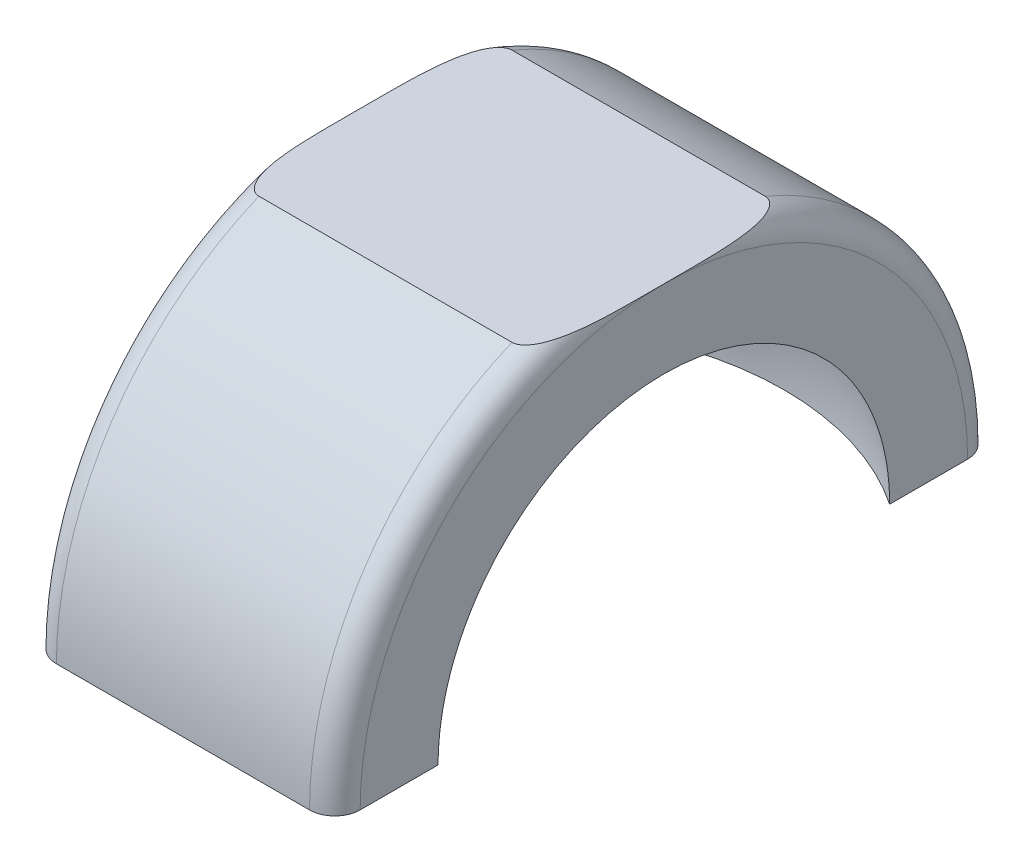
ISO-10303-21;
HEADER;
FILE_DESCRIPTION(('STEP AP214'),'2;1');
FILE_NAME('part.step','',(''),(''),'','','');
FILE_SCHEMA(('AUTOMOTIVE_DESIGN { 1 0 10303 214 1 1 1 1 }'));
ENDSEC;
DATA;
#1=APPLICATION_CONTEXT('core data for automotive mechanical design processes');
#2=APPLICATION_PROTOCOL_DEFINITION('international standard','automotive_design',2000,#1);
#3=PRODUCT_CONTEXT('',#1,'mechanical');
#4=PRODUCT('Part','Part','',(#3));
#5=PRODUCT_RELATED_PRODUCT_CATEGORY('part','',(#4));
#6=PRODUCT_DEFINITION_FORMATION('','',#4);
#7=PRODUCT_DEFINITION_CONTEXT('part definition',#1,'design');
#8=PRODUCT_DEFINITION('design','',#6,#7);
#9=PRODUCT_DEFINITION_SHAPE('','',#8);
#10=(LENGTH_UNIT() NAMED_UNIT(*) SI_UNIT(.MILLI.,.METRE.));
#11=(NAMED_UNIT(*) PLANE_ANGLE_UNIT() SI_UNIT($,.RADIAN.));
#12=(NAMED_UNIT(*) SI_UNIT($,.STERADIAN.) SOLID_ANGLE_UNIT());
#13=UNCERTAINTY_MEASURE_WITH_UNIT(LENGTH_MEASURE(1.E-05),#10,'distance_accuracy_value','');
#14=(GEOMETRIC_REPRESENTATION_CONTEXT(3) GLOBAL_UNCERTAINTY_ASSIGNED_CONTEXT((#13)) GLOBAL_UNIT_ASSIGNED_CONTEXT((#10,
#11,#12)) REPRESENTATION_CONTEXT('',''));
#15=CARTESIAN_POINT('',(0.,0.,0.));
#16=DIRECTION('',(0.,0.,1.));
#17=DIRECTION('',(1.,0.,0.));
#18=AXIS2_PLACEMENT_3D('',#15,#16,#17);
#19=CARTESIAN_POINT('',(10.,0.,0.));
#20=DIRECTION('',(-1.,0.,0.));
#21=DIRECTION('',(0.,0.,1.));
#22=AXIS2_PLACEMENT_3D('',#19,#20,#21);
#23=TOROIDAL_SURFACE('',#22,24.,2.);
#24=CARTESIAN_POINT('',(12.,0.,0.));
#25=DIRECTION('',(-1.,0.,0.));
#26=DIRECTION('',(0.,0.,1.));
#27=AXIS2_PLACEMENT_3D('',#24,#25,#26);
#28=CIRCLE('',#27,24.);
#29=CARTESIAN_POINT('',(12.,0.,24.));
#30=VERTEX_POINT('',#29);
#31=CARTESIAN_POINT('',(12.,24.,0.));
#32=VERTEX_POINT('',#31);
#33=EDGE_CURVE('E48',#30,#32,#28,.T.);
#34=ORIENTED_EDGE('',*,*,#33,.T.);
#35=CARTESIAN_POINT('',(12.0000000000002,24.,0.));
#36=CARTESIAN_POINT('',(12.0000032112972,24.,0.333318370624944));
#37=CARTESIAN_POINT('',(12.0000369376425,24.,0.666636690385218));
#38=CARTESIAN_POINT('',(11.9997462691406,24.,1.33327477904077));
#39=CARTESIAN_POINT('',(11.9994218731332,24.,1.66659454793725));
#40=CARTESIAN_POINT('',(11.9971167553539,24.,2.33330585522278));
#41=CARTESIAN_POINT('',(11.995135657108,24.,2.66669739270359));
#42=CARTESIAN_POINT('',(11.987382631693,24.,3.33342237898503));
#43=CARTESIAN_POINT('',(11.9816110138256,24.,3.66675583030574));
#44=CARTESIAN_POINT('',(11.9660821554231,24.,4.22925457777455));
#45=CARTESIAN_POINT('',(11.9581306579488,24.,4.45846690104528));
#46=CARTESIAN_POINT('',(11.9376839843161,24.,4.91668810412272));
#47=CARTESIAN_POINT('',(11.9251890218679,24.,5.14569699299054));
#48=CARTESIAN_POINT('',(11.8940563210572,24.,5.60339568674352));
#49=CARTESIAN_POINT('',(11.8754163137367,24.,5.83208534238817));
#50=CARTESIAN_POINT('',(11.8299717017088,24.,6.28863487959647));
#51=CARTESIAN_POINT('',(11.8031689811131,24.,6.5164949403774));
#52=CARTESIAN_POINT('',(11.7472776739321,24.,6.91014618979482));
#53=CARTESIAN_POINT('',(11.7207036250663,24.,7.07628927305245));
#54=CARTESIAN_POINT('',(11.6602651251751,24.,7.40722844639932));
#55=CARTESIAN_POINT('',(11.6264021712281,24.,7.57202480589031));
#56=CARTESIAN_POINT('',(11.5494119212752,24.,7.89981844597661));
#57=CARTESIAN_POINT('',(11.5062684373758,24.,8.06281205295968));
#58=CARTESIAN_POINT('',(11.4325985380382,24.,8.3045026196003));
#59=CARTESIAN_POINT('',(11.4065607418726,24.,8.38457040780352));
#60=CARTESIAN_POINT('',(11.3510253330141,24.,8.54349044057223));
#61=CARTESIAN_POINT('',(11.321528415153,24.,8.62234292566682));
#62=CARTESIAN_POINT('',(11.2581656766794,24.,8.77926831696839));
#63=CARTESIAN_POINT('',(11.2242565034422,24.,8.85732386543028));
#64=CARTESIAN_POINT('',(11.1515835022793,24.,9.01112038904928));
#65=CARTESIAN_POINT('',(11.1128221897752,24.,9.08686253837903));
#66=CARTESIAN_POINT('',(11.0297277782235,24.,9.23464189441576));
#67=CARTESIAN_POINT('',(10.9854309122107,24.,9.3066992506055));
#68=CARTESIAN_POINT('',(10.8899193526613,24.,9.44601447281588));
#69=CARTESIAN_POINT('',(10.8387168937979,24.,9.51328051264976));
#70=CARTESIAN_POINT('',(10.7452380030842,24.,9.62063081920906));
#71=CARTESIAN_POINT('',(10.7051812793181,24.,9.66263473592002));
#72=CARTESIAN_POINT('',(10.6205313029516,24.,9.74197770663356));
#73=CARTESIAN_POINT('',(10.5759332419576,24.,9.77931172096246));
#74=CARTESIAN_POINT('',(10.4813819449202,24.,9.84781787827383));
#75=CARTESIAN_POINT('',(10.4313750129516,24.,9.87891742712105));
#76=CARTESIAN_POINT('',(10.3266729907569,24.,9.93185418938677));
#77=CARTESIAN_POINT('',(10.2719900844932,24.,9.95371464266827));
#78=CARTESIAN_POINT('',(10.1730273511311,24.,9.98169520964225));
#79=CARTESIAN_POINT('',(10.129468790481,24.,9.99035573108248));
#80=CARTESIAN_POINT('',(10.0415136477378,24.,10.0001366298849));
#81=CARTESIAN_POINT('',(9.99711761101358,24.,10.0012617551721));
#82=CARTESIAN_POINT('',(9.90882676394153,24.,9.99586257111336));
#83=CARTESIAN_POINT('',(9.86493171650638,24.,9.98934204559354));
#84=CARTESIAN_POINT('',(9.77878109124616,24.,9.96928364420115));
#85=CARTESIAN_POINT('',(9.7365269146013,24.,9.95573990676722));
#86=CARTESIAN_POINT('',(9.63992720292629,24.,9.91684528754731));
#87=CARTESIAN_POINT('',(9.58658719557515,24.,9.88901308058598));
#88=CARTESIAN_POINT('',(9.48501505356487,24.,9.82524143179271));
#89=CARTESIAN_POINT('',(9.43679494660291,24.,9.78928349439656));
#90=CARTESIAN_POINT('',(9.31596862747712,24.,9.6866929371816));
#91=CARTESIAN_POINT('',(9.24755308269309,24.,9.61517616781321));
#92=CARTESIAN_POINT('',(9.12173798187126,24.,9.46311544551836));
#93=CARTESIAN_POINT('',(9.06436974993364,24.,9.38254682034423));
#94=CARTESIAN_POINT('',(8.95651782036297,24.,9.21279170083568));
#95=CARTESIAN_POINT('',(8.90636765207394,24.,9.12339658073665));
#96=CARTESIAN_POINT('',(8.81362150969052,24.,8.9407222863304));
#97=CARTESIAN_POINT('',(8.77103405557575,24.,8.84743887576215));
#98=CARTESIAN_POINT('',(8.69200154728926,24.,8.65821094587404));
#99=CARTESIAN_POINT('',(8.65556358713586,24.,8.56226349986666));
#100=CARTESIAN_POINT('',(8.58785036928036,24.,8.36865771043921));
#101=CARTESIAN_POINT('',(8.55657165945949,24.,8.27100055979621));
#102=CARTESIAN_POINT('',(8.49452950865645,24.,8.06158756638733));
#103=CARTESIAN_POINT('',(8.46436615854089,24.,7.94965518527957));
#104=CARTESIAN_POINT('',(8.40865247510728,24.,7.7246404670472));
#105=CARTESIAN_POINT('',(8.38310307614887,24.,7.6115579018884));
#106=CARTESIAN_POINT('',(8.31224888257978,24.,7.2709188779993));
#107=CARTESIAN_POINT('',(8.27278734062413,24.,7.04214664364708));
#108=CARTESIAN_POINT('',(8.20517744522899,24.,6.58219576041598));
#109=CARTESIAN_POINT('',(8.17706983811534,24.,6.35101144599837));
#110=CARTESIAN_POINT('',(8.12947856099722,24.,5.8877340102058));
#111=CARTESIAN_POINT('',(8.10999655460494,24.,5.65564072221853));
#112=CARTESIAN_POINT('',(8.07725644923241,24.,5.18768771328294));
#113=CARTESIAN_POINT('',(8.06409170355674,24.,4.95182174939653));
#114=CARTESIAN_POINT('',(8.04263936971829,24.,4.47985352954237));
#115=CARTESIAN_POINT('',(8.03435229573301,24.,4.24375125129052));
#116=CARTESIAN_POINT('',(8.02126725748994,24.,3.77221548470928));
#117=CARTESIAN_POINT('',(8.01645816840742,24.,3.53678228489565));
#118=CARTESIAN_POINT('',(8.00916079848506,24.,3.0658976655751));
#119=CARTESIAN_POINT('',(8.00667237456718,24.,2.83044624808663));
#120=CARTESIAN_POINT('',(8.00314726486056,24.,2.36271223492861));
#121=CARTESIAN_POINT('',(8.00209143795818,24.,2.13042976235398));
#122=CARTESIAN_POINT('',(8.00071789688515,24.,1.66586244272779));
#123=CARTESIAN_POINT('',(8.00040018509202,24.,1.43357759567101));
#124=CARTESIAN_POINT('',(8.00005119091622,24.,0.968972711085982));
#125=CARTESIAN_POINT('',(8.00001995184136,24.,0.736652673546385));
#126=CARTESIAN_POINT('',(7.99999408475305,24.,0.272013202606699));
#127=CARTESIAN_POINT('',(7.99999945664451,24.,0.0396937692066078));
#128=CARTESIAN_POINT('',(8.00000084678883,24.,-0.426510676514846));
#129=CARTESIAN_POINT('',(7.9999968017643,24.,-0.660395688814065));
#130=CARTESIAN_POINT('',(8.00014190259765,24.,-1.12816670466346));
#131=CARTESIAN_POINT('',(8.00029104909999,24.,-1.36205270821367));
#132=CARTESIAN_POINT('',(8.00111370574869,24.,-1.82969701927461));
#133=CARTESIAN_POINT('',(8.00178693088462,24.,-2.06345532710612));
#134=CARTESIAN_POINT('',(8.0042336004762,24.,-2.53096518392172));
#135=CARTESIAN_POINT('',(8.00600703510534,24.,-2.76471673294754));
#136=CARTESIAN_POINT('',(8.01137795427343,24.,-3.22707915213118));
#137=CARTESIAN_POINT('',(8.01493462465703,24.,-3.45569044824237));
#138=CARTESIAN_POINT('',(8.02478304215701,24.,-3.91285583709429));
#139=CARTESIAN_POINT('',(8.03107475920861,24.,-4.14140993043618));
#140=CARTESIAN_POINT('',(8.04756811288698,24.,-4.59893086306326));
#141=CARTESIAN_POINT('',(8.05777905958928,24.,-4.82789738305847));
#142=CARTESIAN_POINT('',(8.08354488483207,24.,-5.28551435799917));
#143=CARTESIAN_POINT('',(8.09909907992984,24.,-5.51416484961358));
#144=CARTESIAN_POINT('',(8.13712372410515,24.,-5.96806426630645));
#145=CARTESIAN_POINT('',(8.15950647070729,24.,-6.19332035270045));
#146=CARTESIAN_POINT('',(8.21348655696245,24.,-6.64272797005468));
#147=CARTESIAN_POINT('',(8.2450817096124,24.,-6.86687975034626));
#148=CARTESIAN_POINT('',(8.30163784859851,24.,-7.20113297539648));
#149=CARTESIAN_POINT('',(8.32197124184282,24.,-7.31201894796625));
#150=CARTESIAN_POINT('',(8.36620724524363,24.,-7.53307208686932));
#151=CARTESIAN_POINT('',(8.39010944562003,24.,-7.64323933421482));
#152=CARTESIAN_POINT('',(8.44206801029076,24.,-7.86247240563955));
#153=CARTESIAN_POINT('',(8.47011992287844,24.,-7.97153927786498));
#154=CARTESIAN_POINT('',(8.5311633401834,24.,-8.18827023811862));
#155=CARTESIAN_POINT('',(8.56415327897659,24.,-8.29593475913078));
#156=CARTESIAN_POINT('',(8.61466662939372,24.,-8.44574106167869));
#157=CARTESIAN_POINT('',(8.6297032570958,24.,-8.48872635133043));
#158=CARTESIAN_POINT('',(8.66083866445632,24.,-8.5743183232767));
#159=CARTESIAN_POINT('',(8.67693762337307,24.,-8.6169249402904));
#160=CARTESIAN_POINT('',(8.72699164897903,24.,-8.74415829254694));
#161=CARTESIAN_POINT('',(8.76267715155773,24.,-8.82811809808563));
#162=CARTESIAN_POINT('',(8.83931969761989,24.,-8.99302837938143));
#163=CARTESIAN_POINT('',(8.88024511873908,24.,-9.07399342998768));
#164=CARTESIAN_POINT('',(8.96863876303755,24.,-9.23222566903728));
#165=CARTESIAN_POINT('',(9.01609931038123,24.,-9.30949705450595));
#166=CARTESIAN_POINT('',(9.10636111904431,24.,-9.44011000529705));
#167=CARTESIAN_POINT('',(9.14741752266106,24.,-9.49464784915385));
#168=CARTESIAN_POINT('',(9.23499202878933,24.,-9.59941876467231));
#169=CARTESIAN_POINT('',(9.28152108088911,24.,-9.64964284594727));
#170=CARTESIAN_POINT('',(9.3813411272815,24.,-9.74420685424307));
#171=CARTESIAN_POINT('',(9.43470272076706,24.,-9.78847371669067));
#172=CARTESIAN_POINT('',(9.54823001297531,24.,-9.86718895224718));
#173=CARTESIAN_POINT('',(9.60837134174992,24.,-9.9016710178199));
#174=CARTESIAN_POINT('',(9.7135502774502,24.,-9.94747630826742));
#175=CARTESIAN_POINT('',(9.75688505479648,24.,-9.9626880147675));
#176=CARTESIAN_POINT('',(9.84548101624645,24.,-9.98574109251738));
#177=CARTESIAN_POINT('',(9.89074030445104,24.,-9.99358954941912));
#178=CARTESIAN_POINT('',(9.98212867114721,24.,-10.0011557954406));
#179=CARTESIAN_POINT('',(10.0282604715755,24.,-10.0008414669901));
#180=CARTESIAN_POINT('',(10.1197394795816,24.,-9.99203622265434));
#181=CARTESIAN_POINT('',(10.1650863089253,24.,-9.98354147090436));
#182=CARTESIAN_POINT('',(10.2518309149631,24.,-9.95974527501826));
#183=CARTESIAN_POINT('',(10.2933146290992,24.,-9.94474933730522));
#184=CARTESIAN_POINT('',(10.3737684132198,24.,-9.90915072481761));
#185=CARTESIAN_POINT('',(10.4127375521171,24.,-9.88854598780835));
#186=CARTESIAN_POINT('',(10.514310353692,24.,-9.82681028590918));
#187=CARTESIAN_POINT('',(10.5743167505716,24.,-9.78141983209891));
#188=CARTESIAN_POINT('',(10.6867601738288,24.,-9.68204746446342));
#189=CARTESIAN_POINT('',(10.7391710802959,24.,-9.6280371860263));
#190=CARTESIAN_POINT('',(10.8334718249548,24.,-9.51885468523465));
#191=CARTESIAN_POINT('',(10.8758653995675,24.,-9.46410990591669));
#192=CARTESIAN_POINT('',(10.955865319261,24.,-9.35119562209922));
#193=CARTESIAN_POINT('',(10.993467288732,24.,-9.29302305728638));
#194=CARTESIAN_POINT('',(11.0646165213932,24.,-9.17413072766235));
#195=CARTESIAN_POINT('',(11.0981563479977,24.,-9.11340655728604));
#196=CARTESIAN_POINT('',(11.1616716941555,24.,-8.99016734569872));
#197=CARTESIAN_POINT('',(11.1916485345535,24.,-8.92765297886867));
#198=CARTESIAN_POINT('',(11.2622823804187,24.,-8.77070588448407));
#199=CARTESIAN_POINT('',(11.3011003935321,24.,-8.67544711598761));
#200=CARTESIAN_POINT('',(11.3732088503867,24.,-8.48284081520179));
#201=CARTESIAN_POINT('',(11.406496512795,24.,-8.38549225953626));
#202=CARTESIAN_POINT('',(11.4684843216113,24.,-8.18917313339979));
#203=CARTESIAN_POINT('',(11.4971765073101,24.,-8.09020006880909));
#204=CARTESIAN_POINT('',(11.550609774882,24.,-7.89118646355778));
#205=CARTESIAN_POINT('',(11.575350152715,24.,-7.79114573606544));
#206=CARTESIAN_POINT('',(11.6447376713912,24.,-7.48887108554338));
#207=CARTESIAN_POINT('',(11.6842576192666,24.,-7.28545818128766));
#208=CARTESIAN_POINT('',(11.7530008244918,24.,-6.87720545550559));
#209=CARTESIAN_POINT('',(11.7822352536171,24.,-6.67236743013971));
#210=CARTESIAN_POINT('',(11.8405401585336,24.,-6.19926402227572));
#211=CARTESIAN_POINT('',(11.8668540655969,24.,-5.93066406958119));
#212=CARTESIAN_POINT('',(11.9099344136815,24.,-5.39268113493136));
#213=CARTESIAN_POINT('',(11.9266983618385,24.,-5.12329796695763));
#214=CARTESIAN_POINT('',(11.9534755921896,24.,-4.58390967942385));
#215=CARTESIAN_POINT('',(11.9634812739808,24.,-4.31390420114343));
#216=CARTESIAN_POINT('',(11.9788819188098,24.,-3.77375930489971));
#217=CARTESIAN_POINT('',(11.9842766375968,24.,-3.50361988059937));
#218=CARTESIAN_POINT('',(11.9921348699951,24.,-2.96395555881359));
#219=CARTESIAN_POINT('',(11.9946054270657,24.,-2.69443075182466));
#220=CARTESIAN_POINT('',(11.9979221739512,24.,-2.15536833218577));
#221=CARTESIAN_POINT('',(11.998768333373,24.,-1.88583071939057));
#222=CARTESIAN_POINT('',(11.9997534150278,24.,-1.34691063250215));
#223=CARTESIAN_POINT('',(11.9998927458558,24.,-1.07752815880793));
#224=CARTESIAN_POINT('',(12.0000147405231,24.,-0.538763779001592));
#225=CARTESIAN_POINT('',(11.9999974046881,24.,-0.269381872889463));
#226=CARTESIAN_POINT('',(12.0000000000002,24.,0.));
#227=B_SPLINE_CURVE_WITH_KNOTS('',3,(#35,#36,#37,#38,#39,#40,#41,#42,#43,#44,#45,#46,#47,#48,
#49,#50,#51,#52,#53,#54,#55,#56,#57,#58,#59,#60,#61,#62,#63,#64,#65,#66,#67,#68,#69,#70,#71,#72,
#73,#74,#75,#76,#77,#78,#79,#80,#81,#82,#83,#84,#85,#86,#87,#88,#89,#90,#91,#92,#93,#94,#95,#96,
#97,#98,#99,#100,#101,#102,#103,#104,#105,#106,#107,#108,#109,#110,#111,#112,#113,#114,#115,
#116,#117,#118,#119,#120,#121,#122,#123,#124,#125,#126,#127,#128,#129,#130,#131,#132,#133,#134,
#135,#136,#137,#138,#139,#140,#141,#142,#143,#144,#145,#146,#147,#148,#149,#150,#151,#152,#153,
#154,#155,#156,#157,#158,#159,#160,#161,#162,#163,#164,#165,#166,#167,#168,#169,#170,#171,#172,
#173,#174,#175,#176,#177,#178,#179,#180,#181,#182,#183,#184,#185,#186,#187,#188,#189,#190,#191,
#192,#193,#194,#195,#196,#197,#198,#199,#200,#201,#202,#203,#204,#205,#206,#207,#208,#209,#210,
#211,#212,#213,#214,#215,#216,#217,#218,#219,#220,#221,#222,#223,#224,#225,#226),.UNSPECIFIED.,
.T.,.F.,(4,2,2,2,2,2,2,2,2,2,2,2,2,2,2,2,2,2,2,2,2,2,2,2,2,2,2,2,2,2,2,2,2,2,2,2,2,2,2,2,2,2,2,
2,2,2,2,2,2,2,2,2,2,2,2,2,2,2,2,2,2,2,2,2,2,2,2,2,2,2,2,2,2,2,2,2,2,2,2,2,2,2,2,2,2,2,2,2,2,2,2,
2,2,2,2,4),(0.,0.99995520066757,1.99991364085758,3.00009937632531,4.00020350803274,
4.68822289830605,5.37620993050771,6.06445127579582,6.7525338819526,7.25716920444684,
7.76170097792134,8.26712004020252,8.5196428665089,8.77211505530158,9.02728751227203,
9.28232822765567,9.53577935003109,9.78878719038112,9.96263311325961,10.1366650578676,
10.3126187322994,10.4881271430685,10.6207682454853,10.7533257651287,10.8858177098474,
11.0184204105261,11.1978955251223,11.377783346028,11.6730245875488,11.9690910269845,
12.2761189589302,12.5834906169361,12.89121446854,13.1987315755983,13.5463854768731,
13.8941097019101,14.5901038270583,15.2885739657189,15.9871787590936,16.6958114613416,
17.4045188504047,18.1109491903295,18.8173359731965,19.5141884914985,20.2110432544059,
20.908003363336,21.6049616623497,22.3066167079768,23.0082747054134,23.7095513855221,
24.4108218022766,25.0967281630302,25.7826269842007,26.4701653345502,27.1576157761593,
27.8365842680351,28.515391705474,28.8535504002588,29.1916702965621,29.5294300620778,
29.8670829448073,30.0036890418505,30.1403182491153,30.4138306184936,30.6857639793563,
30.9573806228073,31.1619053410741,31.3668464624063,31.5741081042875,31.7806471634418,
31.9178874178861,32.0549954702209,32.1926430739583,32.330355253181,32.4621986005242,
32.594090489457,32.8185048924268,33.0436735917432,33.2510871706001,33.4586888188927,
33.666664956936,33.8745637534841,34.1829259351316,34.4914427323997,34.8004883218504,
35.1095889084977,35.7308334264169,36.3514010715602,37.1607941011896,37.9703983132472,
38.7809115037339,39.5914676258798,40.4000673537083,41.2086822105647,42.0168295797907,
42.8249752702198),.UNSPECIFIED.);
#228=CARTESIAN_POINT('',(9.99999999999999,24.,9.99999999999999));
#229=VERTEX_POINT('',#228);
#230=EDGE_CURVE('E111',#32,#229,#227,.T.);
#231=ORIENTED_EDGE('',*,*,#230,.T.);
#232=CARTESIAN_POINT('',(9.99999999999999,0.,0.));
#233=DIRECTION('',(-1.,0.,0.));
#234=DIRECTION('',(0.,0.,1.));
#235=AXIS2_PLACEMENT_3D('',#232,#233,#234);
#236=CIRCLE('',#235,26.);
#237=CARTESIAN_POINT('',(9.99999999999999,0.,26.));
#238=VERTEX_POINT('',#237);
#239=EDGE_CURVE('E139',#238,#229,#236,.T.);
#240=ORIENTED_EDGE('',*,*,#239,.F.);
#241=CARTESIAN_POINT('',(10.,0.,24.));
#242=DIRECTION('',(0.,-1.,0.));
#243=DIRECTION('',(1.,0.,0.));
#244=AXIS2_PLACEMENT_3D('',#241,#242,#243);
#245=CIRCLE('',#244,2.);
#246=EDGE_CURVE('E135',#30,#238,#245,.T.);
#247=ORIENTED_EDGE('',*,*,#246,.F.);
#248=EDGE_LOOP('',(#34,#231,#240,#247));
#249=FACE_BOUND('',#248,.T.);
#250=ADVANCED_FACE('F39',(#249),#23,.T.);
#251=CARTESIAN_POINT('',(-22.,0.,0.));
#252=DIRECTION('',(-1.,0.,0.));
#253=DIRECTION('',(0.,0.,1.));
#254=AXIS2_PLACEMENT_3D('',#251,#252,#253);
#255=CYLINDRICAL_SURFACE('',#254,26.);
#256=DIRECTION('',(-1.,0.,0.));
#257=VECTOR('',#256,1.);
#258=CARTESIAN_POINT('',(-22.,24.,9.99999999999999));
#259=LINE('',#258,#257);
#260=CARTESIAN_POINT('',(-9.99999999999971,24.,10.0000000000003));
#261=VERTEX_POINT('',#260);
#262=EDGE_CURVE('E117',#261,#229,#259,.F.);
#263=ORIENTED_EDGE('',*,*,#262,.F.);
#264=CARTESIAN_POINT('',(-9.99999999999998,0.,0.));
#265=DIRECTION('',(-1.,0.,0.));
#266=DIRECTION('',(0.,0.,1.));
#267=AXIS2_PLACEMENT_3D('',#264,#265,#266);
#268=CIRCLE('',#267,26.);
#269=CARTESIAN_POINT('',(-9.99999999999998,0.,26.));
#270=VERTEX_POINT('',#269);
#271=EDGE_CURVE('E144',#270,#261,#268,.T.);
#272=ORIENTED_EDGE('',*,*,#271,.F.);
#273=DIRECTION('',(1.,0.,0.));
#274=VECTOR('',#273,1.);
#275=CARTESIAN_POINT('',(-9.99999999999998,0.,26.));
#276=LINE('',#275,#274);
#277=EDGE_CURVE('E162',#270,#238,#276,.T.);
#278=ORIENTED_EDGE('',*,*,#277,.T.);
#279=ORIENTED_EDGE('',*,*,#239,.T.);
#280=EDGE_LOOP('',(#263,#272,#278,#279));
#281=FACE_BOUND('',#280,.T.);
#282=ADVANCED_FACE('F233',(#281),#255,.T.);
#283=CARTESIAN_POINT('',(-10.,0.,0.));
#284=DIRECTION('',(-1.,0.,0.));
#285=DIRECTION('',(0.,0.,1.));
#286=AXIS2_PLACEMENT_3D('',#283,#284,#285);
#287=TOROIDAL_SURFACE('',#286,24.,2.);
#288=CARTESIAN_POINT('',(-12.,0.,0.));
#289=DIRECTION('',(-1.,0.,0.));
#290=DIRECTION('',(0.,0.,1.));
#291=AXIS2_PLACEMENT_3D('',#288,#289,#290);
#292=CIRCLE('',#291,24.);
#293=CARTESIAN_POINT('',(-12.,24.,0.));
#294=VERTEX_POINT('',#293);
#295=CARTESIAN_POINT('',(-12.,0.,-24.));
#296=VERTEX_POINT('',#295);
#297=EDGE_CURVE('E153',#294,#296,#292,.T.);
#298=ORIENTED_EDGE('',*,*,#297,.F.);
#299=CARTESIAN_POINT('',(-12.0000000000002,24.,0.));
#300=CARTESIAN_POINT('',(-12.0000032112972,24.,-0.333318370624944));
#301=CARTESIAN_POINT('',(-12.0000369376425,24.,-0.666636690385219));
#302=CARTESIAN_POINT('',(-11.9997462691406,24.,-1.33327477904078));
#303=CARTESIAN_POINT('',(-11.9994218731332,24.,-1.66659454793725));
#304=CARTESIAN_POINT('',(-11.9971167553539,24.,-2.33330585522278));
#305=CARTESIAN_POINT('',(-11.995135657108,24.,-2.66669739270359));
#306=CARTESIAN_POINT('',(-11.987382631693,24.,-3.33342237898503));
#307=CARTESIAN_POINT('',(-11.9816110138256,24.,-3.66675583030574));
#308=CARTESIAN_POINT('',(-11.9660821554231,24.,-4.22925457777455));
#309=CARTESIAN_POINT('',(-11.9581306579488,24.,-4.45846690104528));
#310=CARTESIAN_POINT('',(-11.9376839843161,24.,-4.91668810412272));
#311=CARTESIAN_POINT('',(-11.9251890218679,24.,-5.14569699299054));
#312=CARTESIAN_POINT('',(-11.8940563210572,24.,-5.60339568674351));
#313=CARTESIAN_POINT('',(-11.8754163137367,24.,-5.83208534238818));
#314=CARTESIAN_POINT('',(-11.8299717017088,24.,-6.28863487959647));
#315=CARTESIAN_POINT('',(-11.8031689811131,24.,-6.5164949403774));
#316=CARTESIAN_POINT('',(-11.7472776739321,24.,-6.91014618979482));
#317=CARTESIAN_POINT('',(-11.7207036250663,24.,-7.07628927305246));
#318=CARTESIAN_POINT('',(-11.6602651251751,24.,-7.40722844639932));
#319=CARTESIAN_POINT('',(-11.6264021712281,24.,-7.57202480589032));
#320=CARTESIAN_POINT('',(-11.5494119212752,24.,-7.89981844597661));
#321=CARTESIAN_POINT('',(-11.5062684373758,24.,-8.06281205295969));
#322=CARTESIAN_POINT('',(-11.4325985380382,24.,-8.30450261960031));
#323=CARTESIAN_POINT('',(-11.4065607418726,24.,-8.38457040780352));
#324=CARTESIAN_POINT('',(-11.3510253330141,24.,-8.54349044057223));
#325=CARTESIAN_POINT('',(-11.321528415153,24.,-8.62234292566683));
#326=CARTESIAN_POINT('',(-11.2581656766794,24.,-8.77926831696839));
#327=CARTESIAN_POINT('',(-11.2242565034422,24.,-8.85732386543029));
#328=CARTESIAN_POINT('',(-11.1515835022793,24.,-9.01112038904928));
#329=CARTESIAN_POINT('',(-11.1128221897752,24.,-9.08686253837904));
#330=CARTESIAN_POINT('',(-11.0297277782235,24.,-9.23464189441576));
#331=CARTESIAN_POINT('',(-10.9854309122107,24.,-9.3066992506055));
#332=CARTESIAN_POINT('',(-10.8899193526613,24.,-9.44601447281589));
#333=CARTESIAN_POINT('',(-10.8387168937979,24.,-9.51328051264976));
#334=CARTESIAN_POINT('',(-10.7452380030842,24.,-9.62063081920907));
#335=CARTESIAN_POINT('',(-10.7051812793181,24.,-9.66263473592003));
#336=CARTESIAN_POINT('',(-10.6205313029516,24.,-9.74197770663357));
#337=CARTESIAN_POINT('',(-10.5759332419576,24.,-9.77931172096247));
#338=CARTESIAN_POINT('',(-10.4813819449202,24.,-9.84781787827384));
#339=CARTESIAN_POINT('',(-10.4313750129516,24.,-9.87891742712106));
#340=CARTESIAN_POINT('',(-10.3266729907569,24.,-9.93185418938679));
#341=CARTESIAN_POINT('',(-10.2719900844931,24.,-9.95371464266829));
#342=CARTESIAN_POINT('',(-10.1730273511311,24.,-9.98169520964226));
#343=CARTESIAN_POINT('',(-10.129468790481,24.,-9.99035573108248));
#344=CARTESIAN_POINT('',(-10.0415136477378,24.,-10.0001366298849));
#345=CARTESIAN_POINT('',(-9.99711761101358,24.,-10.0012617551721));
#346=CARTESIAN_POINT('',(-9.90882676394152,24.,-9.99586257111337));
#347=CARTESIAN_POINT('',(-9.86493171650638,24.,-9.98934204559354));
#348=CARTESIAN_POINT('',(-9.77878109124616,24.,-9.96928364420116));
#349=CARTESIAN_POINT('',(-9.7365269146013,24.,-9.95573990676723));
#350=CARTESIAN_POINT('',(-9.63992720292629,24.,-9.91684528754733));
#351=CARTESIAN_POINT('',(-9.58658719557514,24.,-9.889013080586));
#352=CARTESIAN_POINT('',(-9.48501505356487,24.,-9.82524143179272));
#353=CARTESIAN_POINT('',(-9.4367949466029,24.,-9.78928349439657));
#354=CARTESIAN_POINT('',(-9.31596862747713,24.,-9.68669293718161));
#355=CARTESIAN_POINT('',(-9.2475530826931,24.,-9.61517616781322));
#356=CARTESIAN_POINT('',(-9.12173798187127,24.,-9.46311544551837));
#357=CARTESIAN_POINT('',(-9.06436974993364,24.,-9.38254682034425));
#358=CARTESIAN_POINT('',(-8.95651782036297,24.,-9.21279170083571));
#359=CARTESIAN_POINT('',(-8.90636765207394,24.,-9.12339658073668));
#360=CARTESIAN_POINT('',(-8.81362150969052,24.,-8.94072228633042));
#361=CARTESIAN_POINT('',(-8.77103405557576,24.,-8.84743887576218));
#362=CARTESIAN_POINT('',(-8.69200154728927,24.,-8.65821094587407));
#363=CARTESIAN_POINT('',(-8.65556358713586,24.,-8.56226349986668));
#364=CARTESIAN_POINT('',(-8.58785036928036,24.,-8.36865771043923));
#365=CARTESIAN_POINT('',(-8.55657165945949,24.,-8.27100055979624));
#366=CARTESIAN_POINT('',(-8.49452950865645,24.,-8.06158756638736));
#367=CARTESIAN_POINT('',(-8.46436615854089,24.,-7.9496551852796));
#368=CARTESIAN_POINT('',(-8.40865247510728,24.,-7.72464046704724));
#369=CARTESIAN_POINT('',(-8.38310307614887,24.,-7.61155790188844));
#370=CARTESIAN_POINT('',(-8.31224888257978,24.,-7.27091887799935));
#371=CARTESIAN_POINT('',(-8.27278734062413,24.,-7.04214664364713));
#372=CARTESIAN_POINT('',(-8.20517744522899,24.,-6.58219576041603));
#373=CARTESIAN_POINT('',(-8.17706983811534,24.,-6.35101144599842));
#374=CARTESIAN_POINT('',(-8.12947856099722,24.,-5.88773401020586));
#375=CARTESIAN_POINT('',(-8.10999655460495,24.,-5.65564072221859));
#376=CARTESIAN_POINT('',(-8.07725644923241,24.,-5.18768771328301));
#377=CARTESIAN_POINT('',(-8.06409170355674,24.,-4.95182174939661));
#378=CARTESIAN_POINT('',(-8.04263936971829,24.,-4.47985352954246));
#379=CARTESIAN_POINT('',(-8.03435229573301,24.,-4.24375125129062));
#380=CARTESIAN_POINT('',(-8.02126725748994,24.,-3.77221548470939));
#381=CARTESIAN_POINT('',(-8.01645816840742,24.,-3.53678228489576));
#382=CARTESIAN_POINT('',(-8.00916079848506,24.,-3.06589766557523));
#383=CARTESIAN_POINT('',(-8.00667237456718,24.,-2.83044624808675));
#384=CARTESIAN_POINT('',(-8.00314726486056,24.,-2.36271223492875));
#385=CARTESIAN_POINT('',(-8.00209143795817,24.,-2.13042976235412));
#386=CARTESIAN_POINT('',(-8.00071789688514,24.,-1.66586244272795));
#387=CARTESIAN_POINT('',(-8.00040018509202,24.,-1.43357759567117));
#388=CARTESIAN_POINT('',(-8.00005119091622,24.,-0.968972711086151));
#389=CARTESIAN_POINT('',(-8.00001995184136,24.,-0.736652673546559));
#390=CARTESIAN_POINT('',(-7.99999408475304,24.,-0.272013202606883));
#391=CARTESIAN_POINT('',(-7.99999945664451,24.,-0.0396937692067972));
#392=CARTESIAN_POINT('',(-8.00000084678882,24.,0.426510676514644));
#393=CARTESIAN_POINT('',(-7.9999968017643,24.,0.660395688813856));
#394=CARTESIAN_POINT('',(-8.00014190259765,24.,1.12816670466324));
#395=CARTESIAN_POINT('',(-8.00029104909998,24.,1.36205270821344));
#396=CARTESIAN_POINT('',(-8.00111370574869,24.,1.82969701927437));
#397=CARTESIAN_POINT('',(-8.00178693088462,24.,2.06345532710587));
#398=CARTESIAN_POINT('',(-8.0042336004762,24.,2.53096518392146));
#399=CARTESIAN_POINT('',(-8.00600703510534,24.,2.76471673294727));
#400=CARTESIAN_POINT('',(-8.01137795427343,24.,3.22707915213091));
#401=CARTESIAN_POINT('',(-8.01493462465702,24.,3.45569044824209));
#402=CARTESIAN_POINT('',(-8.024783042157,24.,3.912855837094));
#403=CARTESIAN_POINT('',(-8.03107475920859,24.,4.14140993043589));
#404=CARTESIAN_POINT('',(-8.04756811288696,24.,4.59893086306296));
#405=CARTESIAN_POINT('',(-8.05777905958926,24.,4.82789738305817));
#406=CARTESIAN_POINT('',(-8.08354488483205,24.,5.28551435799886));
#407=CARTESIAN_POINT('',(-8.09909907992981,24.,5.51416484961327));
#408=CARTESIAN_POINT('',(-8.13712372410512,24.,5.96806426630612));
#409=CARTESIAN_POINT('',(-8.15950647070726,24.,6.19332035270012));
#410=CARTESIAN_POINT('',(-8.21348655696241,24.,6.64272797005435));
#411=CARTESIAN_POINT('',(-8.24508170961234,24.,6.86687975034592));
#412=CARTESIAN_POINT('',(-8.30163784859844,24.,7.20113297539614));
#413=CARTESIAN_POINT('',(-8.32197124184275,24.,7.31201894796592));
#414=CARTESIAN_POINT('',(-8.36620724524356,24.,7.53307208686899));
#415=CARTESIAN_POINT('',(-8.39010944561994,24.,7.64323933421448));
#416=CARTESIAN_POINT('',(-8.44206801029067,24.,7.86247240563922));
#417=CARTESIAN_POINT('',(-8.47011992287834,24.,7.97153927786463));
#418=CARTESIAN_POINT('',(-8.5311633401833,24.,8.18827023811828));
#419=CARTESIAN_POINT('',(-8.56415327897648,24.,8.29593475913044));
#420=CARTESIAN_POINT('',(-8.61466662939361,24.,8.44574106167837));
#421=CARTESIAN_POINT('',(-8.62970325709568,24.,8.48872635133012));
#422=CARTESIAN_POINT('',(-8.6608386644562,24.,8.5743183232764));
#423=CARTESIAN_POINT('',(-8.67693762337296,24.,8.61692494029011));
#424=CARTESIAN_POINT('',(-8.72699164897891,24.,8.74415829254668));
#425=CARTESIAN_POINT('',(-8.76267715155761,24.,8.82811809808538));
#426=CARTESIAN_POINT('',(-8.83931969761978,24.,8.99302837938122));
#427=CARTESIAN_POINT('',(-8.88024511873898,24.,9.07399342998749));
#428=CARTESIAN_POINT('',(-8.96863876303746,24.,9.23222566903713));
#429=CARTESIAN_POINT('',(-9.01609931038113,24.,9.30949705450583));
#430=CARTESIAN_POINT('',(-9.10636111904422,24.,9.44011000529695));
#431=CARTESIAN_POINT('',(-9.14741752266097,24.,9.49464784915374));
#432=CARTESIAN_POINT('',(-9.23499202878923,24.,9.59941876467222));
#433=CARTESIAN_POINT('',(-9.28152108088901,24.,9.64964284594718));
#434=CARTESIAN_POINT('',(-9.38134112728139,24.,9.74420685424299));
#435=CARTESIAN_POINT('',(-9.43470272076695,24.,9.7884737166906));
#436=CARTESIAN_POINT('',(-9.54823001297519,24.,9.86718895224711));
#437=CARTESIAN_POINT('',(-9.6083713417498,24.,9.90167101781984));
#438=CARTESIAN_POINT('',(-9.71355027745007,24.,9.94747630826738));
#439=CARTESIAN_POINT('',(-9.75688505479636,24.,9.96268801476746));
#440=CARTESIAN_POINT('',(-9.84548101624632,24.,9.98574109251737));
#441=CARTESIAN_POINT('',(-9.89074030445091,24.,9.99358954941911));
#442=CARTESIAN_POINT('',(-9.98212867114709,24.,10.0011557954406));
#443=CARTESIAN_POINT('',(-10.0282604715754,24.,10.0008414669902));
#444=CARTESIAN_POINT('',(-10.1197394795815,24.,9.99203622265438));
#445=CARTESIAN_POINT('',(-10.1650863089252,24.,9.98354147090441));
#446=CARTESIAN_POINT('',(-10.251830914963,24.,9.95974527501832));
#447=CARTESIAN_POINT('',(-10.293314629099,24.,9.94474933730528));
#448=CARTESIAN_POINT('',(-10.3737684132197,24.,9.90915072481767));
#449=CARTESIAN_POINT('',(-10.4127375521169,24.,9.88854598780842));
#450=CARTESIAN_POINT('',(-10.5143103536919,24.,9.82681028590925));
#451=CARTESIAN_POINT('',(-10.5743167505715,24.,9.78141983209901));
#452=CARTESIAN_POINT('',(-10.6867601738286,24.,9.68204746446355));
#453=CARTESIAN_POINT('',(-10.7391710802958,24.,9.62803718602645));
#454=CARTESIAN_POINT('',(-10.8334718249547,24.,9.51885468523483));
#455=CARTESIAN_POINT('',(-10.8758653995673,24.,9.46410990591689));
#456=CARTESIAN_POINT('',(-10.9558653192608,24.,9.35119562209946));
#457=CARTESIAN_POINT('',(-10.9934672887318,24.,9.29302305728664));
#458=CARTESIAN_POINT('',(-11.064616521393,24.,9.17413072766264));
#459=CARTESIAN_POINT('',(-11.0981563479975,24.,9.11340655728635));
#460=CARTESIAN_POINT('',(-11.1616716941553,24.,8.99016734569907));
#461=CARTESIAN_POINT('',(-11.1916485345534,24.,8.92765297886903));
#462=CARTESIAN_POINT('',(-11.2622823804186,24.,8.77070588448449));
#463=CARTESIAN_POINT('',(-11.3011003935319,24.,8.67544711598806));
#464=CARTESIAN_POINT('',(-11.3732088503866,24.,8.48284081520231));
#465=CARTESIAN_POINT('',(-11.4064965127948,24.,8.38549225953682));
#466=CARTESIAN_POINT('',(-11.4684843216111,24.,8.18917313340043));
#467=CARTESIAN_POINT('',(-11.4971765073099,24.,8.09020006880977));
#468=CARTESIAN_POINT('',(-11.5506097748818,24.,7.89118646355853));
#469=CARTESIAN_POINT('',(-11.5753501527149,24.,7.79114573606623));
#470=CARTESIAN_POINT('',(-11.644737671391,24.,7.48887108554428));
#471=CARTESIAN_POINT('',(-11.6842576192664,24.,7.28545818128863));
#472=CARTESIAN_POINT('',(-11.7530008244916,24.,6.87720545550672));
#473=CARTESIAN_POINT('',(-11.7822352536169,24.,6.67236743014091));
#474=CARTESIAN_POINT('',(-11.8405401585334,24.,6.19926402227695));
#475=CARTESIAN_POINT('',(-11.8668540655968,24.,5.93066406958238));
#476=CARTESIAN_POINT('',(-11.9099344136814,24.,5.39268113493244));
#477=CARTESIAN_POINT('',(-11.9266983618385,24.,5.12329796695866));
#478=CARTESIAN_POINT('',(-11.9534755921896,24.,4.58390967942477));
#479=CARTESIAN_POINT('',(-11.9634812739807,24.,4.3139042011443));
#480=CARTESIAN_POINT('',(-11.9788819188098,24.,3.77375930490048));
#481=CARTESIAN_POINT('',(-11.9842766375968,24.,3.50361988060008));
#482=CARTESIAN_POINT('',(-11.9921348699951,24.,2.96395555881419));
#483=CARTESIAN_POINT('',(-11.9946054270657,24.,2.69443075182521));
#484=CARTESIAN_POINT('',(-11.9979221739512,24.,2.15536833218621));
#485=CARTESIAN_POINT('',(-11.998768333373,24.,1.88583071939095));
#486=CARTESIAN_POINT('',(-11.9997534150278,24.,1.34691063250242));
#487=CARTESIAN_POINT('',(-11.9998927458558,24.,1.07752815880814));
#488=CARTESIAN_POINT('',(-12.0000147405231,24.,0.538763779001699));
#489=CARTESIAN_POINT('',(-11.9999974046881,24.,0.269381872889517));
#490=CARTESIAN_POINT('',(-12.0000000000002,24.,0.));
#491=B_SPLINE_CURVE_WITH_KNOTS('',3,(#299,#300,#301,#302,#303,#304,#305,#306,#307,#308,#309,
#310,#311,#312,#313,#314,#315,#316,#317,#318,#319,#320,#321,#322,#323,#324,#325,#326,#327,#328,
#329,#330,#331,#332,#333,#334,#335,#336,#337,#338,#339,#340,#341,#342,#343,#344,#345,#346,#347,
#348,#349,#350,#351,#352,#353,#354,#355,#356,#357,#358,#359,#360,#361,#362,#363,#364,#365,#366,
#367,#368,#369,#370,#371,#372,#373,#374,#375,#376,#377,#378,#379,#380,#381,#382,#383,#384,#385,
#386,#387,#388,#389,#390,#391,#392,#393,#394,#395,#396,#397,#398,#399,#400,#401,#402,#403,#404,
#405,#406,#407,#408,#409,#410,#411,#412,#413,#414,#415,#416,#417,#418,#419,#420,#421,#422,#423,
#424,#425,#426,#427,#428,#429,#430,#431,#432,#433,#434,#435,#436,#437,#438,#439,#440,#441,#442,
#443,#444,#445,#446,#447,#448,#449,#450,#451,#452,#453,#454,#455,#456,#457,#458,#459,#460,#461,
#462,#463,#464,#465,#466,#467,#468,#469,#470,#471,#472,#473,#474,#475,#476,#477,#478,#479,#480,
#481,#482,#483,#484,#485,#486,#487,#488,#489,#490),.UNSPECIFIED.,.T.,.F.,(4,2,2,2,2,2,2,2,2,2,2,
2,2,2,2,2,2,2,2,2,2,2,2,2,2,2,2,2,2,2,2,2,2,2,2,2,2,2,2,2,2,2,2,2,2,2,2,2,2,2,2,2,2,2,2,2,2,2,2,
2,2,2,2,2,2,2,2,2,2,2,2,2,2,2,2,2,2,2,2,2,2,2,2,2,2,2,2,2,2,2,2,2,2,2,2,4),(0.,
0.999955200667571,1.99991364085759,3.00009937632531,4.00020350803274,4.68822289830605,
5.3762099305077,6.06445127579582,6.7525338819526,7.25716920444684,7.76170097792135,
8.26712004020252,8.5196428665089,8.77211505530158,9.02728751227203,9.28232822765568,
9.5357793500311,9.78878719038114,9.96263311325962,10.1366650578676,10.3126187322994,
10.4881271430685,10.6207682454853,10.7533257651287,10.8858177098475,11.0184204105261,
11.1978955251223,11.377783346028,11.6730245875488,11.9690910269845,12.2761189589302,
12.5834906169361,12.89121446854,13.1987315755983,13.5463854768731,13.8941097019101,
14.5901038270583,15.2885739657188,15.9871787590936,16.6958114613415,17.4045188504046,
18.1109491903294,18.8173359731964,19.5141884914984,20.2110432544058,20.9080033633358,
21.6049616623496,22.3066167079766,23.0082747054131,23.7095513855219,24.4108218022763,
25.0967281630299,25.7826269842004,26.4701653345499,27.157615776159,27.8365842680348,
28.5153917054736,28.8535504002585,29.1916702965617,29.5294300620775,29.867082944807,
30.0036890418502,30.1403182491151,30.4138306184934,30.6857639793561,30.9573806228072,
31.161905341074,31.3668464624062,31.5741081042874,31.7806471634417,31.917887417886,
32.0549954702208,32.1926430739582,32.3303552531809,32.4621986005241,32.5940904894569,
32.8185048924267,33.043673591743,33.2510871705998,33.4586888188924,33.6666649569357,
33.8745637534837,34.1829259351311,34.4914427323991,34.8004883218497,35.1095889084969,
35.7308334264159,36.3514010715589,37.1607941011885,37.9703983132463,38.7809115037331,
39.5914676258791,40.4000673537078,41.2086822105644,42.0168295797906,42.8249752702198),.UNSPECIFIED.);
#492=CARTESIAN_POINT('',(-9.99999999999997,24.,-10.));
#493=VERTEX_POINT('',#492);
#494=EDGE_CURVE('E55',#294,#493,#491,.T.);
#495=ORIENTED_EDGE('',*,*,#494,.T.);
#496=CARTESIAN_POINT('',(-9.99999999999998,0.,-26.));
#497=VERTEX_POINT('',#496);
#498=EDGE_CURVE('E148',#493,#497,#268,.T.);
#499=ORIENTED_EDGE('',*,*,#498,.T.);
#500=CARTESIAN_POINT('',(-10.,0.,-24.));
#501=DIRECTION('',(0.,1.,0.));
#502=DIRECTION('',(1.,0.,0.));
#503=AXIS2_PLACEMENT_3D('',#500,#501,#502);
#504=CIRCLE('',#503,2.);
#505=EDGE_CURVE('E188',#497,#296,#504,.T.);
#506=ORIENTED_EDGE('',*,*,#505,.T.);
#507=EDGE_LOOP('',(#298,#495,#499,#506));
#508=FACE_BOUND('',#507,.T.);
#509=ADVANCED_FACE('F228',(#508),#287,.T.);
#510=CARTESIAN_POINT('',(0.,0.,0.));
#511=DIRECTION('',(0.,0.,1.));
#512=DIRECTION('',(1.,0.,0.));
#513=AXIS2_PLACEMENT_3D('',#510,#511,#512);
#514=SPHERICAL_SURFACE('',#513,21.5);
#515=CARTESIAN_POINT('',(12.,0.,0.));
#516=DIRECTION('',(-1.,0.,0.));
#517=DIRECTION('',(0.,0.,1.));
#518=AXIS2_PLACEMENT_3D('',#515,#516,#517);
#519=CIRCLE('',#518,17.8395627749113);
#520=CARTESIAN_POINT('',(12.,0.,17.8395627749113));
#521=VERTEX_POINT('',#520);
#522=CARTESIAN_POINT('',(12.,0.,-17.8395627749113));
#523=VERTEX_POINT('',#522);
#524=EDGE_CURVE('E11',#521,#523,#519,.T.);
#525=ORIENTED_EDGE('',*,*,#524,.F.);
#526=CARTESIAN_POINT('',(0.,0.,0.));
#527=DIRECTION('',(0.,-1.,0.));
#528=DIRECTION('',(1.,0.,0.));
#529=AXIS2_PLACEMENT_3D('',#526,#527,#528);
#530=CIRCLE('',#529,21.5);
#531=CARTESIAN_POINT('',(-12.,0.,17.8395627749113));
#532=VERTEX_POINT('',#531);
#533=EDGE_CURVE('E174',#521,#532,#530,.T.);
#534=ORIENTED_EDGE('',*,*,#533,.T.);
#535=CARTESIAN_POINT('',(-12.,0.,0.));
#536=DIRECTION('',(-1.,0.,0.));
#537=DIRECTION('',(0.,0.,1.));
#538=AXIS2_PLACEMENT_3D('',#535,#536,#537);
#539=CIRCLE('',#538,17.8395627749113);
#540=CARTESIAN_POINT('',(-12.,0.,-17.8395627749113));
#541=VERTEX_POINT('',#540);
#542=EDGE_CURVE('E154',#532,#541,#539,.T.);
#543=ORIENTED_EDGE('',*,*,#542,.T.);
#544=CARTESIAN_POINT('',(0.,0.,0.));
#545=DIRECTION('',(0.,1.,0.));
#546=DIRECTION('',(1.,0.,0.));
#547=AXIS2_PLACEMENT_3D('',#544,#545,#546);
#548=CIRCLE('',#547,21.5);
#549=EDGE_CURVE('E122',#523,#541,#548,.T.);
#550=ORIENTED_EDGE('',*,*,#549,.F.);
#551=EDGE_LOOP('',(#525,#534,#543,#550));
#552=FACE_BOUND('',#551,.T.);
#553=ADVANCED_FACE('F252',(#552),#514,.F.);
#554=CARTESIAN_POINT('',(12.,0.,17.8395627749113));
#555=DIRECTION('',(-1.,0.,0.));
#556=DIRECTION('',(0.,0.,1.));
#557=AXIS2_PLACEMENT_3D('',#554,#555,#556);
#558=PLANE('',#557);
#559=ORIENTED_EDGE('',*,*,#33,.F.);
#560=DIRECTION('',(0.,0.,1.));
#561=VECTOR('',#560,1.);
#562=CARTESIAN_POINT('',(12.,0.,17.8395627749113));
#563=LINE('',#562,#561);
#564=EDGE_CURVE('E157',#521,#30,#563,.T.);
#565=ORIENTED_EDGE('',*,*,#564,.F.);
#566=ORIENTED_EDGE('',*,*,#524,.T.);
#567=DIRECTION('',(0.,0.,-1.));
#568=VECTOR('',#567,1.);
#569=CARTESIAN_POINT('',(12.,0.,-17.8395627749113));
#570=LINE('',#569,#568);
#571=CARTESIAN_POINT('',(12.,0.,-24.));
#572=VERTEX_POINT('',#571);
#573=EDGE_CURVE('E177',#523,#572,#570,.T.);
#574=ORIENTED_EDGE('',*,*,#573,.T.);
#575=CARTESIAN_POINT('',(12.,24.,-1.13046402135109E-05));
#576=VERTEX_POINT('',#575);
#577=EDGE_CURVE('E130',#576,#572,#28,.T.);
#578=ORIENTED_EDGE('',*,*,#577,.F.);
#579=DIRECTION('',(0.,0.,-1.));
#580=VECTOR('',#579,1.);
#581=CARTESIAN_POINT('',(12.,24.,22.));
#582=LINE('',#581,#580);
#583=EDGE_CURVE('E114',#32,#576,#582,.T.);
#584=ORIENTED_EDGE('',*,*,#583,.F.);
#585=EDGE_LOOP('',(#559,#565,#566,#574,#578,#584));
#586=FACE_BOUND('',#585,.T.);
#587=ADVANCED_FACE('F41',(#586),#558,.F.);
#588=CARTESIAN_POINT('',(9.99999999999999,24.,-9.99999999999999));
#589=VERTEX_POINT('',#588);
#590=CARTESIAN_POINT('',(9.99999999999999,0.,-26.));
#591=VERTEX_POINT('',#590);
#592=EDGE_CURVE('E143',#589,#591,#236,.T.);
#593=ORIENTED_EDGE('',*,*,#592,.F.);
#594=EDGE_CURVE('E123',#589,#576,#227,.T.);
#595=ORIENTED_EDGE('',*,*,#594,.T.);
#596=ORIENTED_EDGE('',*,*,#577,.T.);
#597=CARTESIAN_POINT('',(10.,0.,-24.));
#598=DIRECTION('',(0.,1.,0.));
#599=DIRECTION('',(1.,0.,0.));
#600=AXIS2_PLACEMENT_3D('',#597,#598,#599);
#601=CIRCLE('',#600,2.);
#602=EDGE_CURVE('E180',#572,#591,#601,.T.);
#603=ORIENTED_EDGE('',*,*,#602,.T.);
#604=EDGE_LOOP('',(#593,#595,#596,#603));
#605=FACE_BOUND('',#604,.T.);
#606=ADVANCED_FACE('F205',(#605),#23,.T.);
#607=DIRECTION('',(-1.,0.,0.));
#608=VECTOR('',#607,1.);
#609=CARTESIAN_POINT('',(-22.,24.,-9.99999999999999));
#610=LINE('',#609,#608);
#611=EDGE_CURVE('E220',#589,#493,#610,.T.);
#612=ORIENTED_EDGE('',*,*,#611,.F.);
#613=ORIENTED_EDGE('',*,*,#592,.T.);
#614=DIRECTION('',(1.,0.,0.));
#615=VECTOR('',#614,1.);
#616=CARTESIAN_POINT('',(-9.99999999999998,0.,-26.));
#617=LINE('',#616,#615);
#618=EDGE_CURVE('E184',#497,#591,#617,.T.);
#619=ORIENTED_EDGE('',*,*,#618,.F.);
#620=ORIENTED_EDGE('',*,*,#498,.F.);
#621=EDGE_LOOP('',(#612,#613,#619,#620));
#622=FACE_BOUND('',#621,.T.);
#623=ADVANCED_FACE('F226',(#622),#255,.T.);
#624=ORIENTED_EDGE('',*,*,#271,.T.);
#625=EDGE_CURVE('E132',#261,#294,#491,.T.);
#626=ORIENTED_EDGE('',*,*,#625,.T.);
#627=CARTESIAN_POINT('',(-12.,0.,24.));
#628=VERTEX_POINT('',#627);
#629=EDGE_CURVE('E149',#628,#294,#292,.T.);
#630=ORIENTED_EDGE('',*,*,#629,.F.);
#631=CARTESIAN_POINT('',(-10.,0.,24.));
#632=DIRECTION('',(0.,-1.,0.));
#633=DIRECTION('',(1.,0.,0.));
#634=AXIS2_PLACEMENT_3D('',#631,#632,#633);
#635=CIRCLE('',#634,2.);
#636=EDGE_CURVE('E166',#270,#628,#635,.T.);
#637=ORIENTED_EDGE('',*,*,#636,.F.);
#638=EDGE_LOOP('',(#624,#626,#630,#637));
#639=FACE_BOUND('',#638,.T.);
#640=ADVANCED_FACE('F221',(#639),#287,.T.);
#641=CARTESIAN_POINT('',(-12.,0.,17.8395627749113));
#642=DIRECTION('',(-1.,0.,0.));
#643=DIRECTION('',(0.,0.,1.));
#644=AXIS2_PLACEMENT_3D('',#641,#642,#643);
#645=PLANE('',#644);
#646=DIRECTION('',(0.,0.,1.));
#647=VECTOR('',#646,1.);
#648=CARTESIAN_POINT('',(-12.,0.,17.8395627749113));
#649=LINE('',#648,#647);
#650=EDGE_CURVE('E170',#532,#628,#649,.T.);
#651=ORIENTED_EDGE('',*,*,#650,.T.);
#652=ORIENTED_EDGE('',*,*,#629,.T.);
#653=ORIENTED_EDGE('',*,*,#297,.T.);
#654=DIRECTION('',(0.,0.,-1.));
#655=VECTOR('',#654,1.);
#656=CARTESIAN_POINT('',(-12.,0.,-17.8395627749113));
#657=LINE('',#656,#655);
#658=EDGE_CURVE('E192',#541,#296,#657,.T.);
#659=ORIENTED_EDGE('',*,*,#658,.F.);
#660=ORIENTED_EDGE('',*,*,#542,.F.);
#661=EDGE_LOOP('',(#651,#652,#653,#659,#660));
#662=FACE_BOUND('',#661,.T.);
#663=ADVANCED_FACE('F225',(#662),#645,.T.);
#664=CARTESIAN_POINT('',(0.,0.,0.));
#665=DIRECTION('',(0.,-1.,0.));
#666=DIRECTION('',(1.,0.,0.));
#667=AXIS2_PLACEMENT_3D('',#664,#665,#666);
#668=PLANE('',#667);
#669=ORIENTED_EDGE('',*,*,#533,.F.);
#670=ORIENTED_EDGE('',*,*,#564,.T.);
#671=ORIENTED_EDGE('',*,*,#246,.T.);
#672=ORIENTED_EDGE('',*,*,#277,.F.);
#673=ORIENTED_EDGE('',*,*,#636,.T.);
#674=ORIENTED_EDGE('',*,*,#650,.F.);
#675=EDGE_LOOP('',(#669,#670,#671,#672,#673,#674));
#676=FACE_BOUND('',#675,.T.);
#677=ADVANCED_FACE('F229',(#676),#668,.T.);
#678=CARTESIAN_POINT('',(0.,0.,0.));
#679=DIRECTION('',(0.,1.,0.));
#680=DIRECTION('',(1.,0.,0.));
#681=AXIS2_PLACEMENT_3D('',#678,#679,#680);
#682=PLANE('',#681);
#683=ORIENTED_EDGE('',*,*,#549,.T.);
#684=ORIENTED_EDGE('',*,*,#658,.T.);
#685=ORIENTED_EDGE('',*,*,#505,.F.);
#686=ORIENTED_EDGE('',*,*,#618,.T.);
#687=ORIENTED_EDGE('',*,*,#602,.F.);
#688=ORIENTED_EDGE('',*,*,#573,.F.);
#689=EDGE_LOOP('',(#683,#684,#685,#686,#687,#688));
#690=FACE_BOUND('',#689,.T.);
#691=ADVANCED_FACE('F211',(#690),#682,.F.);
#692=CARTESIAN_POINT('',(-12.,24.,22.));
#693=DIRECTION('',(0.,-1.,0.));
#694=DIRECTION('',(0.,0.,-1.));
#695=AXIS2_PLACEMENT_3D('',#692,#693,#694);
#696=PLANE('',#695);
#697=ORIENTED_EDGE('',*,*,#583,.T.);
#698=ORIENTED_EDGE('',*,*,#594,.F.);
#699=ORIENTED_EDGE('',*,*,#611,.T.);
#700=ORIENTED_EDGE('',*,*,#494,.F.);
#701=ORIENTED_EDGE('',*,*,#625,.F.);
#702=ORIENTED_EDGE('',*,*,#262,.T.);
#703=ORIENTED_EDGE('',*,*,#230,.F.);
#704=EDGE_LOOP('',(#697,#698,#699,#700,#701,#702,#703));
#705=FACE_BOUND('',#704,.T.);
#706=ADVANCED_FACE('F113',(#705),#696,.F.);
#707=CLOSED_SHELL('',(#250,#282,#509,#553,#587,#606,#623,#640,#663,#677,#691,#706));
#708=MANIFOLD_SOLID_BREP('B2',#707);
#709=ADVANCED_BREP_SHAPE_REPRESENTATION('',(#18,#708),#14);
#710=SHAPE_DEFINITION_REPRESENTATION(#9,#709);
ENDSEC;
END-ISO-10303-21;
